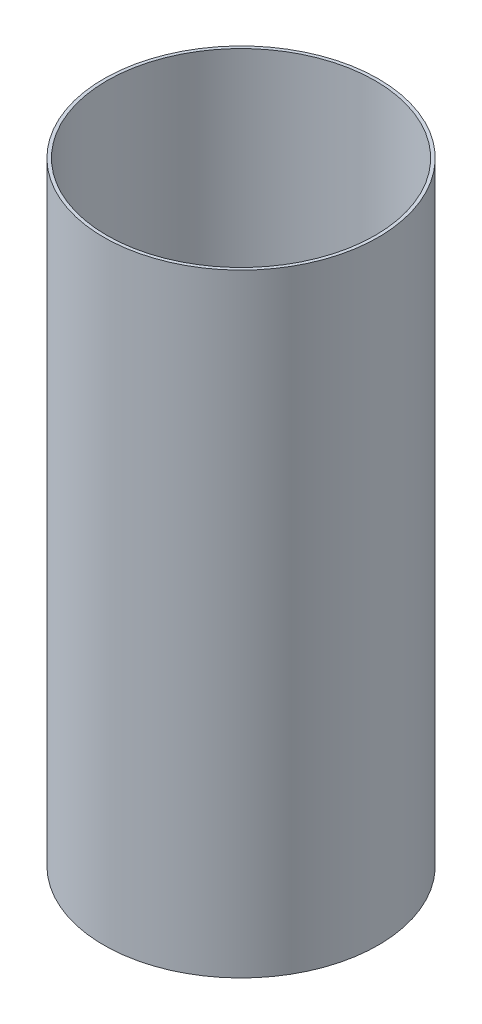
ISO-10303-21;
HEADER;
FILE_DESCRIPTION(('STEP AP214'),'2;1');
FILE_NAME('part.step','',(''),(''),'','','');
FILE_SCHEMA(('AUTOMOTIVE_DESIGN { 1 0 10303 214 1 1 1 1 }'));
ENDSEC;
DATA;
#1=APPLICATION_CONTEXT('core data for automotive mechanical design processes');
#2=APPLICATION_PROTOCOL_DEFINITION('international standard','automotive_design',2000,#1);
#3=PRODUCT_CONTEXT('',#1,'mechanical');
#4=PRODUCT('Part','Part','',(#3));
#5=PRODUCT_RELATED_PRODUCT_CATEGORY('part','',(#4));
#6=PRODUCT_DEFINITION_FORMATION('','',#4);
#7=PRODUCT_DEFINITION_CONTEXT('part definition',#1,'design');
#8=PRODUCT_DEFINITION('design','',#6,#7);
#9=PRODUCT_DEFINITION_SHAPE('','',#8);
#10=(LENGTH_UNIT() NAMED_UNIT(*) SI_UNIT(.MILLI.,.METRE.));
#11=(NAMED_UNIT(*) PLANE_ANGLE_UNIT() SI_UNIT($,.RADIAN.));
#12=(NAMED_UNIT(*) SI_UNIT($,.STERADIAN.) SOLID_ANGLE_UNIT());
#13=UNCERTAINTY_MEASURE_WITH_UNIT(LENGTH_MEASURE(1.E-05),#10,'distance_accuracy_value','');
#14=(GEOMETRIC_REPRESENTATION_CONTEXT(3) GLOBAL_UNCERTAINTY_ASSIGNED_CONTEXT((#13)) GLOBAL_UNIT_ASSIGNED_CONTEXT((#10,
#11,#12)) REPRESENTATION_CONTEXT('',''));
#15=CARTESIAN_POINT('',(0.,0.,0.));
#16=DIRECTION('',(0.,0.,1.));
#17=DIRECTION('',(1.,0.,0.));
#18=AXIS2_PLACEMENT_3D('',#15,#16,#17);
#19=CARTESIAN_POINT('',(0.,304.8,0.));
#20=DIRECTION('',(0.,1.,0.));
#21=DIRECTION('',(0.,0.,1.));
#22=AXIS2_PLACEMENT_3D('',#19,#20,#21);
#23=PLANE('',#22);
#24=CARTESIAN_POINT('',(0.,304.8,0.));
#25=DIRECTION('',(0.,1.,0.));
#26=DIRECTION('',(0.,0.,1.));
#27=AXIS2_PLACEMENT_3D('',#24,#25,#26);
#28=CIRCLE('',#27,68.2625);
#29=CARTESIAN_POINT('',(0.,304.8,-68.2625));
#30=VERTEX_POINT('',#29);
#31=EDGE_CURVE('E10',#30,#30,#28,.T.);
#32=ORIENTED_EDGE('',*,*,#31,.T.);
#33=EDGE_LOOP('',(#32));
#34=FACE_BOUND('',#33,.T.);
#35=CARTESIAN_POINT('',(0.,304.8,0.));
#36=DIRECTION('',(0.,1.,0.));
#37=DIRECTION('',(0.,0.,1.));
#38=AXIS2_PLACEMENT_3D('',#35,#36,#37);
#39=CIRCLE('',#38,66.675);
#40=CARTESIAN_POINT('',(0.,304.8,-66.675));
#41=VERTEX_POINT('',#40);
#42=EDGE_CURVE('E42',#41,#41,#39,.T.);
#43=ORIENTED_EDGE('',*,*,#42,.F.);
#44=EDGE_LOOP('',(#43));
#45=FACE_BOUND('',#44,.T.);
#46=ADVANCED_FACE('F31',(#34,#45),#23,.T.);
#47=CARTESIAN_POINT('',(0.,0.,0.));
#48=DIRECTION('',(0.,1.,0.));
#49=DIRECTION('',(0.,0.,1.));
#50=AXIS2_PLACEMENT_3D('',#47,#48,#49);
#51=PLANE('',#50);
#52=CARTESIAN_POINT('',(0.,0.,0.));
#53=DIRECTION('',(0.,1.,0.));
#54=DIRECTION('',(0.,0.,1.));
#55=AXIS2_PLACEMENT_3D('',#52,#53,#54);
#56=CIRCLE('',#55,68.2625);
#57=CARTESIAN_POINT('',(0.,0.,-68.2625));
#58=VERTEX_POINT('',#57);
#59=EDGE_CURVE('E35',#58,#58,#56,.T.);
#60=ORIENTED_EDGE('',*,*,#59,.F.);
#61=EDGE_LOOP('',(#60));
#62=FACE_BOUND('',#61,.T.);
#63=CARTESIAN_POINT('',(0.,0.,0.));
#64=DIRECTION('',(0.,1.,0.));
#65=DIRECTION('',(0.,0.,1.));
#66=AXIS2_PLACEMENT_3D('',#63,#64,#65);
#67=CIRCLE('',#66,66.675);
#68=CARTESIAN_POINT('',(0.,0.,-66.675));
#69=VERTEX_POINT('',#68);
#70=EDGE_CURVE('E44',#69,#69,#67,.T.);
#71=ORIENTED_EDGE('',*,*,#70,.T.);
#72=EDGE_LOOP('',(#71));
#73=FACE_BOUND('',#72,.T.);
#74=ADVANCED_FACE('F54',(#62,#73),#51,.F.);
#75=CARTESIAN_POINT('',(0.,304.8,0.));
#76=DIRECTION('',(0.,-1.,0.));
#77=DIRECTION('',(0.,0.,-1.));
#78=AXIS2_PLACEMENT_3D('',#75,#76,#77);
#79=CYLINDRICAL_SURFACE('',#78,68.2625);
#80=CARTESIAN_POINT('',(0.,304.8,-68.2625));
#81=CARTESIAN_POINT('',(0.,301.625,-68.2625));
#82=CARTESIAN_POINT('',(0.,298.45,-68.2625));
#83=CARTESIAN_POINT('',(0.,292.1,-68.2625));
#84=CARTESIAN_POINT('',(0.,288.925,-68.2625));
#85=CARTESIAN_POINT('',(0.,282.575,-68.2625));
#86=CARTESIAN_POINT('',(0.,279.4,-68.2625));
#87=CARTESIAN_POINT('',(0.,273.05,-68.2625));
#88=CARTESIAN_POINT('',(0.,269.875,-68.2625));
#89=CARTESIAN_POINT('',(0.,263.525,-68.2625));
#90=CARTESIAN_POINT('',(0.,260.35,-68.2625));
#91=CARTESIAN_POINT('',(0.,254.,-68.2625));
#92=CARTESIAN_POINT('',(0.,250.825,-68.2625));
#93=CARTESIAN_POINT('',(0.,244.475,-68.2625));
#94=CARTESIAN_POINT('',(0.,241.3,-68.2625));
#95=CARTESIAN_POINT('',(0.,234.95,-68.2625));
#96=CARTESIAN_POINT('',(0.,231.775,-68.2625));
#97=CARTESIAN_POINT('',(0.,225.425,-68.2625));
#98=CARTESIAN_POINT('',(0.,222.25,-68.2625));
#99=CARTESIAN_POINT('',(0.,215.9,-68.2625));
#100=CARTESIAN_POINT('',(0.,212.725,-68.2625));
#101=CARTESIAN_POINT('',(0.,206.375,-68.2625));
#102=CARTESIAN_POINT('',(0.,203.2,-68.2625));
#103=CARTESIAN_POINT('',(0.,196.85,-68.2625));
#104=CARTESIAN_POINT('',(0.,193.675,-68.2625));
#105=CARTESIAN_POINT('',(0.,187.325,-68.2625));
#106=CARTESIAN_POINT('',(0.,184.15,-68.2625));
#107=CARTESIAN_POINT('',(0.,177.8,-68.2625));
#108=CARTESIAN_POINT('',(0.,174.625,-68.2625));
#109=CARTESIAN_POINT('',(0.,168.275,-68.2625));
#110=CARTESIAN_POINT('',(0.,165.1,-68.2625));
#111=CARTESIAN_POINT('',(0.,158.75,-68.2625));
#112=CARTESIAN_POINT('',(0.,155.575,-68.2625));
#113=CARTESIAN_POINT('',(0.,149.225,-68.2625));
#114=CARTESIAN_POINT('',(0.,146.05,-68.2625));
#115=CARTESIAN_POINT('',(0.,139.7,-68.2625));
#116=CARTESIAN_POINT('',(0.,136.525,-68.2625));
#117=CARTESIAN_POINT('',(0.,130.175,-68.2625));
#118=CARTESIAN_POINT('',(0.,127.,-68.2625));
#119=CARTESIAN_POINT('',(0.,120.65,-68.2625));
#120=CARTESIAN_POINT('',(0.,117.475,-68.2625));
#121=CARTESIAN_POINT('',(0.,111.125,-68.2625));
#122=CARTESIAN_POINT('',(0.,107.95,-68.2625));
#123=CARTESIAN_POINT('',(0.,101.6,-68.2625));
#124=CARTESIAN_POINT('',(0.,98.425,-68.2625));
#125=CARTESIAN_POINT('',(0.,92.075,-68.2625));
#126=CARTESIAN_POINT('',(0.,88.9,-68.2625));
#127=CARTESIAN_POINT('',(0.,82.55,-68.2625));
#128=CARTESIAN_POINT('',(0.,79.375,-68.2625));
#129=CARTESIAN_POINT('',(0.,73.025,-68.2625));
#130=CARTESIAN_POINT('',(0.,69.85,-68.2625));
#131=CARTESIAN_POINT('',(0.,63.5,-68.2625));
#132=CARTESIAN_POINT('',(0.,60.325,-68.2625));
#133=CARTESIAN_POINT('',(0.,53.975,-68.2625));
#134=CARTESIAN_POINT('',(0.,50.8,-68.2625));
#135=CARTESIAN_POINT('',(0.,44.45,-68.2625));
#136=CARTESIAN_POINT('',(0.,41.275,-68.2625));
#137=CARTESIAN_POINT('',(0.,34.925,-68.2625));
#138=CARTESIAN_POINT('',(0.,31.75,-68.2625));
#139=CARTESIAN_POINT('',(0.,25.4,-68.2625));
#140=CARTESIAN_POINT('',(0.,22.225,-68.2625));
#141=CARTESIAN_POINT('',(0.,15.875,-68.2625));
#142=CARTESIAN_POINT('',(0.,12.7,-68.2625));
#143=CARTESIAN_POINT('',(0.,6.35,-68.2625));
#144=CARTESIAN_POINT('',(0.,3.175,-68.2625));
#145=CARTESIAN_POINT('',(0.,0.,-68.2625));
#146=B_SPLINE_CURVE_WITH_KNOTS('',3,(#80,#81,#82,#83,#84,#85,#86,#87,#88,#89,#90,#91,#92,#93,
#94,#95,#96,#97,#98,#99,#100,#101,#102,#103,#104,#105,#106,#107,#108,#109,#110,#111,#112,#113,
#114,#115,#116,#117,#118,#119,#120,#121,#122,#123,#124,#125,#126,#127,#128,#129,#130,#131,#132,
#133,#134,#135,#136,#137,#138,#139,#140,#141,#142,#143,#144,#145),.UNSPECIFIED.,.F.,.F.,(4,2,2,
2,2,2,2,2,2,2,2,2,2,2,2,2,2,2,2,2,2,2,2,2,2,2,2,2,2,2,2,2,4),(0.,9.52500000000001,19.05,28.575,
38.1,47.625,57.15,66.675,76.2,85.7250000000001,95.2500000000001,104.775,114.3,123.825,133.35,
142.875,152.4,161.925,171.45,180.975,190.5,200.025,209.55,219.075,228.6,238.125,247.65,257.175,
266.7,276.225,285.75,295.275,304.8),.UNSPECIFIED.);
#147=EDGE_CURVE('BSEAM33',#30,#58,#146,.T.);
#148=ORIENTED_EDGE('',*,*,#31,.F.);
#149=ORIENTED_EDGE('',*,*,#59,.T.);
#150=ORIENTED_EDGE('',*,*,#147,.T.);
#151=ORIENTED_EDGE('',*,*,#147,.F.);
#152=EDGE_LOOP('',(#148,#150,#149,#151));
#153=FACE_BOUND('',#152,.T.);
#154=ADVANCED_FACE('F33',(#153),#79,.T.);
#155=CARTESIAN_POINT('',(0.,304.8,0.));
#156=DIRECTION('',(0.,-1.,0.));
#157=DIRECTION('',(0.,0.,-1.));
#158=AXIS2_PLACEMENT_3D('',#155,#156,#157);
#159=CYLINDRICAL_SURFACE('',#158,66.675);
#160=CARTESIAN_POINT('',(0.,304.8,-66.675));
#161=CARTESIAN_POINT('',(0.,301.625,-66.675));
#162=CARTESIAN_POINT('',(0.,298.45,-66.675));
#163=CARTESIAN_POINT('',(0.,292.1,-66.675));
#164=CARTESIAN_POINT('',(0.,288.925,-66.675));
#165=CARTESIAN_POINT('',(0.,282.575,-66.675));
#166=CARTESIAN_POINT('',(0.,279.4,-66.675));
#167=CARTESIAN_POINT('',(0.,273.05,-66.675));
#168=CARTESIAN_POINT('',(0.,269.875,-66.675));
#169=CARTESIAN_POINT('',(0.,263.525,-66.675));
#170=CARTESIAN_POINT('',(0.,260.35,-66.675));
#171=CARTESIAN_POINT('',(0.,254.,-66.675));
#172=CARTESIAN_POINT('',(0.,250.825,-66.675));
#173=CARTESIAN_POINT('',(0.,244.475,-66.675));
#174=CARTESIAN_POINT('',(0.,241.3,-66.675));
#175=CARTESIAN_POINT('',(0.,234.95,-66.675));
#176=CARTESIAN_POINT('',(0.,231.775,-66.675));
#177=CARTESIAN_POINT('',(0.,225.425,-66.675));
#178=CARTESIAN_POINT('',(0.,222.25,-66.675));
#179=CARTESIAN_POINT('',(0.,215.9,-66.675));
#180=CARTESIAN_POINT('',(0.,212.725,-66.675));
#181=CARTESIAN_POINT('',(0.,206.375,-66.675));
#182=CARTESIAN_POINT('',(0.,203.2,-66.675));
#183=CARTESIAN_POINT('',(0.,196.85,-66.675));
#184=CARTESIAN_POINT('',(0.,193.675,-66.675));
#185=CARTESIAN_POINT('',(0.,187.325,-66.675));
#186=CARTESIAN_POINT('',(0.,184.15,-66.675));
#187=CARTESIAN_POINT('',(0.,177.8,-66.675));
#188=CARTESIAN_POINT('',(0.,174.625,-66.675));
#189=CARTESIAN_POINT('',(0.,168.275,-66.675));
#190=CARTESIAN_POINT('',(0.,165.1,-66.675));
#191=CARTESIAN_POINT('',(0.,158.75,-66.675));
#192=CARTESIAN_POINT('',(0.,155.575,-66.675));
#193=CARTESIAN_POINT('',(0.,149.225,-66.675));
#194=CARTESIAN_POINT('',(0.,146.05,-66.675));
#195=CARTESIAN_POINT('',(0.,139.7,-66.675));
#196=CARTESIAN_POINT('',(0.,136.525,-66.675));
#197=CARTESIAN_POINT('',(0.,130.175,-66.675));
#198=CARTESIAN_POINT('',(0.,127.,-66.675));
#199=CARTESIAN_POINT('',(0.,120.65,-66.675));
#200=CARTESIAN_POINT('',(0.,117.475,-66.675));
#201=CARTESIAN_POINT('',(0.,111.125,-66.675));
#202=CARTESIAN_POINT('',(0.,107.95,-66.675));
#203=CARTESIAN_POINT('',(0.,101.6,-66.675));
#204=CARTESIAN_POINT('',(0.,98.425,-66.675));
#205=CARTESIAN_POINT('',(0.,92.075,-66.675));
#206=CARTESIAN_POINT('',(0.,88.9,-66.675));
#207=CARTESIAN_POINT('',(0.,82.55,-66.675));
#208=CARTESIAN_POINT('',(0.,79.375,-66.675));
#209=CARTESIAN_POINT('',(0.,73.025,-66.675));
#210=CARTESIAN_POINT('',(0.,69.85,-66.675));
#211=CARTESIAN_POINT('',(0.,63.5,-66.675));
#212=CARTESIAN_POINT('',(0.,60.325,-66.675));
#213=CARTESIAN_POINT('',(0.,53.975,-66.675));
#214=CARTESIAN_POINT('',(0.,50.8,-66.675));
#215=CARTESIAN_POINT('',(0.,44.45,-66.675));
#216=CARTESIAN_POINT('',(0.,41.275,-66.675));
#217=CARTESIAN_POINT('',(0.,34.925,-66.675));
#218=CARTESIAN_POINT('',(0.,31.75,-66.675));
#219=CARTESIAN_POINT('',(0.,25.4,-66.675));
#220=CARTESIAN_POINT('',(0.,22.225,-66.675));
#221=CARTESIAN_POINT('',(0.,15.875,-66.675));
#222=CARTESIAN_POINT('',(0.,12.7,-66.675));
#223=CARTESIAN_POINT('',(0.,6.35,-66.675));
#224=CARTESIAN_POINT('',(0.,3.175,-66.675));
#225=CARTESIAN_POINT('',(0.,0.,-66.675));
#226=B_SPLINE_CURVE_WITH_KNOTS('',3,(#160,#161,#162,#163,#164,#165,#166,#167,#168,#169,#170,
#171,#172,#173,#174,#175,#176,#177,#178,#179,#180,#181,#182,#183,#184,#185,#186,#187,#188,#189,
#190,#191,#192,#193,#194,#195,#196,#197,#198,#199,#200,#201,#202,#203,#204,#205,#206,#207,#208,
#209,#210,#211,#212,#213,#214,#215,#216,#217,#218,#219,#220,#221,#222,#223,#224,#225),
.UNSPECIFIED.,.F.,.F.,(4,2,2,2,2,2,2,2,2,2,2,2,2,2,2,2,2,2,2,2,2,2,2,2,2,2,2,2,2,2,2,2,4),(0.,
9.52500000000001,19.05,28.575,38.1,47.625,57.15,66.675,76.2,85.7250000000001,95.2500000000001,
104.775,114.3,123.825,133.35,142.875,152.4,161.925,171.45,180.975,190.5,200.025,209.55,219.075,
228.6,238.125,247.65,257.175,266.7,276.225,285.75,295.275,304.8),.UNSPECIFIED.);
#227=EDGE_CURVE('BSEAM50',#41,#69,#226,.T.);
#228=ORIENTED_EDGE('',*,*,#42,.T.);
#229=ORIENTED_EDGE('',*,*,#70,.F.);
#230=ORIENTED_EDGE('',*,*,#227,.T.);
#231=ORIENTED_EDGE('',*,*,#227,.F.);
#232=EDGE_LOOP('',(#228,#230,#229,#231));
#233=FACE_BOUND('',#232,.T.);
#234=ADVANCED_FACE('F50',(#233),#159,.F.);
#235=CLOSED_SHELL('',(#46,#74,#154,#234));
#236=MANIFOLD_SOLID_BREP('B2',#235);
#237=ADVANCED_BREP_SHAPE_REPRESENTATION('',(#18,#236),#14);
#238=SHAPE_DEFINITION_REPRESENTATION(#9,#237);
ENDSEC;
END-ISO-10303-21;
